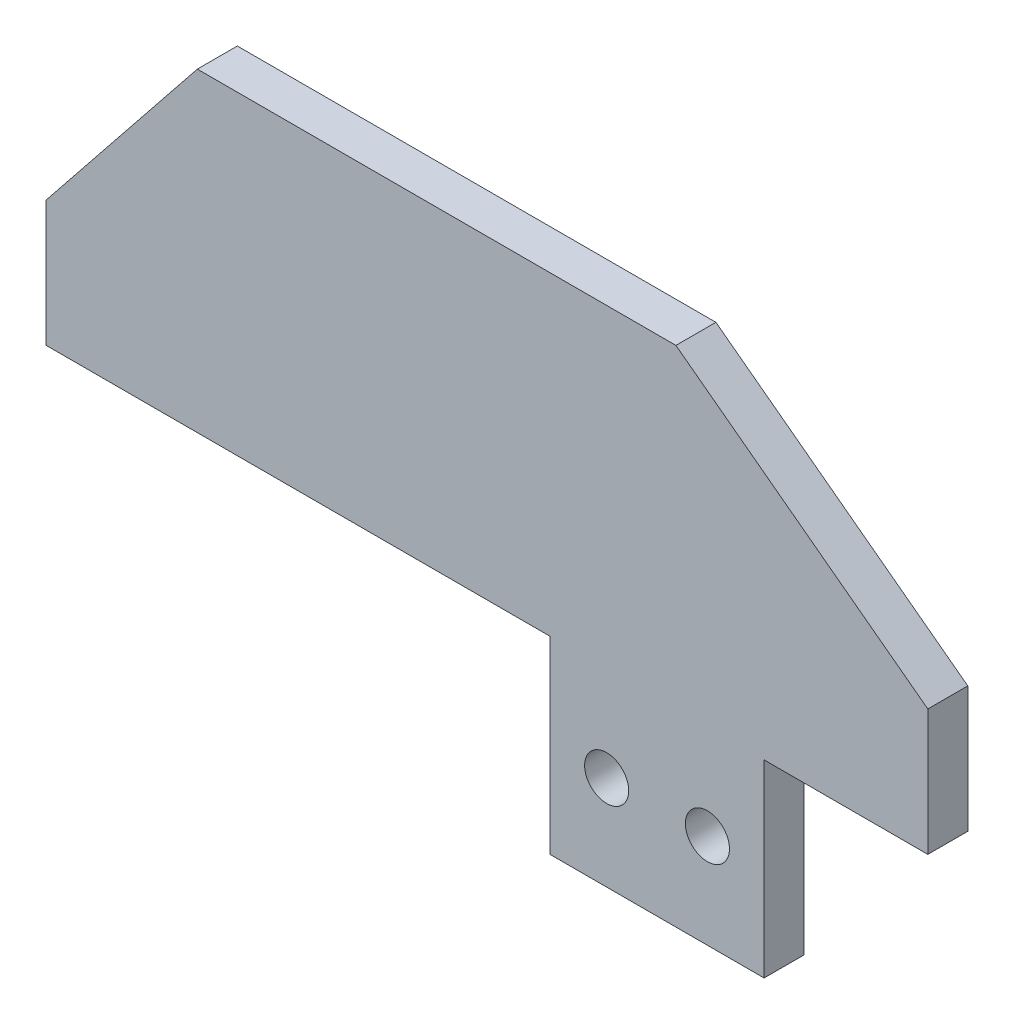
ISO-10303-21;
HEADER;
FILE_DESCRIPTION(('STEP AP214'),'2;1');
FILE_NAME('part.step','',(''),(''),'','','');
FILE_SCHEMA(('AUTOMOTIVE_DESIGN { 1 0 10303 214 1 1 1 1 }'));
ENDSEC;
DATA;
#1=APPLICATION_CONTEXT('core data for automotive mechanical design processes');
#2=APPLICATION_PROTOCOL_DEFINITION('international standard','automotive_design',2000,#1);
#3=PRODUCT_CONTEXT('',#1,'mechanical');
#4=PRODUCT('Part','Part','',(#3));
#5=PRODUCT_RELATED_PRODUCT_CATEGORY('part','',(#4));
#6=PRODUCT_DEFINITION_FORMATION('','',#4);
#7=PRODUCT_DEFINITION_CONTEXT('part definition',#1,'design');
#8=PRODUCT_DEFINITION('design','',#6,#7);
#9=PRODUCT_DEFINITION_SHAPE('','',#8);
#10=(LENGTH_UNIT() NAMED_UNIT(*) SI_UNIT(.MILLI.,.METRE.));
#11=(NAMED_UNIT(*) PLANE_ANGLE_UNIT() SI_UNIT($,.RADIAN.));
#12=(NAMED_UNIT(*) SI_UNIT($,.STERADIAN.) SOLID_ANGLE_UNIT());
#13=UNCERTAINTY_MEASURE_WITH_UNIT(LENGTH_MEASURE(1.E-05),#10,'distance_accuracy_value','');
#14=(GEOMETRIC_REPRESENTATION_CONTEXT(3) GLOBAL_UNCERTAINTY_ASSIGNED_CONTEXT((#13)) GLOBAL_UNIT_ASSIGNED_CONTEXT((#10,
#11,#12)) REPRESENTATION_CONTEXT('',''));
#15=CARTESIAN_POINT('',(0.,0.,0.));
#16=DIRECTION('',(0.,0.,1.));
#17=DIRECTION('',(1.,0.,0.));
#18=AXIS2_PLACEMENT_3D('',#15,#16,#17);
#19=CARTESIAN_POINT('',(8.50000000000001,0.,-3.175));
#20=DIRECTION('',(1.,0.,0.));
#21=DIRECTION('',(0.,1.,0.));
#22=AXIS2_PLACEMENT_3D('',#19,#20,#21);
#23=PLANE('',#22);
#24=DIRECTION('',(0.,-1.,0.));
#25=VECTOR('',#24,1.);
#26=CARTESIAN_POINT('',(8.50000000000001,0.,0.));
#27=LINE('',#26,#25);
#28=CARTESIAN_POINT('',(8.5,57.,0.));
#29=VERTEX_POINT('',#28);
#30=CARTESIAN_POINT('',(8.5,42.,0.));
#31=VERTEX_POINT('',#30);
#32=EDGE_CURVE('E196',#29,#31,#27,.T.);
#33=ORIENTED_EDGE('',*,*,#32,.T.);
#34=DIRECTION('',(0.,0.,1.));
#35=VECTOR('',#34,1.);
#36=CARTESIAN_POINT('',(8.5,42.,-3.175));
#37=LINE('',#36,#35);
#38=CARTESIAN_POINT('',(8.5,42.,-3.175));
#39=VERTEX_POINT('',#38);
#40=EDGE_CURVE('E171',#39,#31,#37,.T.);
#41=ORIENTED_EDGE('',*,*,#40,.F.);
#42=DIRECTION('',(0.,-1.,0.));
#43=VECTOR('',#42,1.);
#44=CARTESIAN_POINT('',(8.50000000000001,0.,-3.175));
#45=LINE('',#44,#43);
#46=CARTESIAN_POINT('',(8.5,57.,-3.175));
#47=VERTEX_POINT('',#46);
#48=EDGE_CURVE('E151',#47,#39,#45,.T.);
#49=ORIENTED_EDGE('',*,*,#48,.F.);
#50=DIRECTION('',(0.,0.,1.));
#51=VECTOR('',#50,1.);
#52=CARTESIAN_POINT('',(8.5,57.,-3.175));
#53=LINE('',#52,#51);
#54=EDGE_CURVE('E11',#47,#29,#53,.T.);
#55=ORIENTED_EDGE('',*,*,#54,.T.);
#56=EDGE_LOOP('',(#33,#41,#49,#55));
#57=FACE_BOUND('',#56,.T.);
#58=ADVANCED_FACE('F43',(#57),#23,.T.);
#59=CARTESIAN_POINT('',(0.,57.,-3.175));
#60=DIRECTION('',(0.,1.,0.));
#61=DIRECTION('',(0.,0.,-1.));
#62=AXIS2_PLACEMENT_3D('',#59,#60,#61);
#63=PLANE('',#62);
#64=DIRECTION('',(1.,0.,0.));
#65=VECTOR('',#64,1.);
#66=CARTESIAN_POINT('',(0.,57.,0.));
#67=LINE('',#66,#65);
#68=CARTESIAN_POINT('',(21.5,57.,0.));
#69=VERTEX_POINT('',#68);
#70=EDGE_CURVE('E189',#29,#69,#67,.T.);
#71=ORIENTED_EDGE('',*,*,#70,.F.);
#72=ORIENTED_EDGE('',*,*,#54,.F.);
#73=DIRECTION('',(1.,0.,0.));
#74=VECTOR('',#73,1.);
#75=CARTESIAN_POINT('',(0.,57.,-3.175));
#76=LINE('',#75,#74);
#77=CARTESIAN_POINT('',(21.5,57.,-3.175));
#78=VERTEX_POINT('',#77);
#79=EDGE_CURVE('E104',#47,#78,#76,.T.);
#80=ORIENTED_EDGE('',*,*,#79,.T.);
#81=DIRECTION('',(0.,0.,1.));
#82=VECTOR('',#81,1.);
#83=CARTESIAN_POINT('',(21.5,57.,-3.175));
#84=LINE('',#83,#82);
#85=EDGE_CURVE('E52',#78,#69,#84,.T.);
#86=ORIENTED_EDGE('',*,*,#85,.T.);
#87=EDGE_LOOP('',(#71,#72,#80,#86));
#88=FACE_BOUND('',#87,.T.);
#89=ADVANCED_FACE('F188',(#88),#63,.F.);
#90=CARTESIAN_POINT('',(21.5,0.,-3.175));
#91=DIRECTION('',(-1.,0.,0.));
#92=DIRECTION('',(0.,0.,-1.));
#93=AXIS2_PLACEMENT_3D('',#90,#91,#92);
#94=PLANE('',#93);
#95=DIRECTION('',(0.,1.,0.));
#96=VECTOR('',#95,1.);
#97=CARTESIAN_POINT('',(21.5,0.,0.));
#98=LINE('',#97,#96);
#99=CARTESIAN_POINT('',(21.5,67.,0.));
#100=VERTEX_POINT('',#99);
#101=EDGE_CURVE('E194',#69,#100,#98,.T.);
#102=ORIENTED_EDGE('',*,*,#101,.F.);
#103=ORIENTED_EDGE('',*,*,#85,.F.);
#104=DIRECTION('',(0.,1.,0.));
#105=VECTOR('',#104,1.);
#106=CARTESIAN_POINT('',(21.5,0.,-3.175));
#107=LINE('',#106,#105);
#108=CARTESIAN_POINT('',(21.5,67.,-3.175));
#109=VERTEX_POINT('',#108);
#110=EDGE_CURVE('E150',#78,#109,#107,.T.);
#111=ORIENTED_EDGE('',*,*,#110,.T.);
#112=DIRECTION('',(0.,0.,1.));
#113=VECTOR('',#112,1.);
#114=CARTESIAN_POINT('',(21.5,67.,-3.175));
#115=LINE('',#114,#113);
#116=EDGE_CURVE('E184',#109,#100,#115,.T.);
#117=ORIENTED_EDGE('',*,*,#116,.T.);
#118=EDGE_LOOP('',(#102,#103,#111,#117));
#119=FACE_BOUND('',#118,.T.);
#120=ADVANCED_FACE('F216',(#119),#94,.F.);
#121=CARTESIAN_POINT('',(39.9,53.2,-3.175));
#122=DIRECTION('',(-0.6,-0.8,0.));
#123=DIRECTION('',(0.8,-0.6,0.));
#124=AXIS2_PLACEMENT_3D('',#121,#122,#123);
#125=PLANE('',#124);
#126=DIRECTION('',(-0.8,0.6,0.));
#127=VECTOR('',#126,1.);
#128=CARTESIAN_POINT('',(39.9,53.2,0.));
#129=LINE('',#128,#127);
#130=CARTESIAN_POINT('',(1.5,82.,0.));
#131=VERTEX_POINT('',#130);
#132=EDGE_CURVE('E198',#100,#131,#129,.T.);
#133=ORIENTED_EDGE('',*,*,#132,.F.);
#134=ORIENTED_EDGE('',*,*,#116,.F.);
#135=DIRECTION('',(-0.8,0.6,0.));
#136=VECTOR('',#135,1.);
#137=CARTESIAN_POINT('',(39.9,53.2,-3.175));
#138=LINE('',#137,#136);
#139=CARTESIAN_POINT('',(1.5,82.,-3.175));
#140=VERTEX_POINT('',#139);
#141=EDGE_CURVE('E155',#109,#140,#138,.T.);
#142=ORIENTED_EDGE('',*,*,#141,.T.);
#143=DIRECTION('',(0.,0.,1.));
#144=VECTOR('',#143,1.);
#145=CARTESIAN_POINT('',(1.5,82.,-3.175));
#146=LINE('',#145,#144);
#147=EDGE_CURVE('E181',#140,#131,#146,.T.);
#148=ORIENTED_EDGE('',*,*,#147,.T.);
#149=EDGE_LOOP('',(#133,#134,#142,#148));
#150=FACE_BOUND('',#149,.T.);
#151=ADVANCED_FACE('F213',(#150),#125,.F.);
#152=CARTESIAN_POINT('',(0.,82.,-3.175));
#153=DIRECTION('',(0.,-1.,0.));
#154=DIRECTION('',(1.,0.,0.));
#155=AXIS2_PLACEMENT_3D('',#152,#153,#154);
#156=PLANE('',#155);
#157=DIRECTION('',(-1.,0.,0.));
#158=VECTOR('',#157,1.);
#159=CARTESIAN_POINT('',(0.,82.,0.));
#160=LINE('',#159,#158);
#161=CARTESIAN_POINT('',(-36.5,82.,0.));
#162=VERTEX_POINT('',#161);
#163=EDGE_CURVE('E206',#131,#162,#160,.T.);
#164=ORIENTED_EDGE('',*,*,#163,.F.);
#165=ORIENTED_EDGE('',*,*,#147,.F.);
#166=DIRECTION('',(-1.,0.,0.));
#167=VECTOR('',#166,1.);
#168=CARTESIAN_POINT('',(0.,82.,-3.175));
#169=LINE('',#168,#167);
#170=CARTESIAN_POINT('',(-36.5,82.,-3.175));
#171=VERTEX_POINT('',#170);
#172=EDGE_CURVE('E218',#140,#171,#169,.T.);
#173=ORIENTED_EDGE('',*,*,#172,.T.);
#174=DIRECTION('',(0.,0.,1.));
#175=VECTOR('',#174,1.);
#176=CARTESIAN_POINT('',(-36.5,82.,-3.175));
#177=LINE('',#176,#175);
#178=EDGE_CURVE('E178',#171,#162,#177,.T.);
#179=ORIENTED_EDGE('',*,*,#178,.T.);
#180=EDGE_LOOP('',(#164,#165,#173,#179));
#181=FACE_BOUND('',#180,.T.);
#182=ADVANCED_FACE('F273',(#181),#156,.F.);
#183=CARTESIAN_POINT('',(-62.2560975609756,49.8048780487805,-3.175));
#184=DIRECTION('',(0.78086880944303,-0.624695047554425,0.));
#185=DIRECTION('',(0.624695047554425,0.78086880944303,0.));
#186=AXIS2_PLACEMENT_3D('',#183,#184,#185);
#187=PLANE('',#186);
#188=DIRECTION('',(-0.624695047554425,-0.78086880944303,0.));
#189=VECTOR('',#188,1.);
#190=CARTESIAN_POINT('',(-62.2560975609756,49.8048780487805,0.));
#191=LINE('',#190,#189);
#192=CARTESIAN_POINT('',(-48.5,67.,0.));
#193=VERTEX_POINT('',#192);
#194=EDGE_CURVE('E204',#162,#193,#191,.T.);
#195=ORIENTED_EDGE('',*,*,#194,.F.);
#196=ORIENTED_EDGE('',*,*,#178,.F.);
#197=DIRECTION('',(-0.624695047554425,-0.78086880944303,0.));
#198=VECTOR('',#197,1.);
#199=CARTESIAN_POINT('',(-62.2560975609756,49.8048780487805,-3.175));
#200=LINE('',#199,#198);
#201=CARTESIAN_POINT('',(-48.5,67.,-3.175));
#202=VERTEX_POINT('',#201);
#203=EDGE_CURVE('E146',#171,#202,#200,.T.);
#204=ORIENTED_EDGE('',*,*,#203,.T.);
#205=DIRECTION('',(0.,0.,1.));
#206=VECTOR('',#205,1.);
#207=CARTESIAN_POINT('',(-48.5,67.,-3.175));
#208=LINE('',#207,#206);
#209=EDGE_CURVE('E175',#202,#193,#208,.T.);
#210=ORIENTED_EDGE('',*,*,#209,.T.);
#211=EDGE_LOOP('',(#195,#196,#204,#210));
#212=FACE_BOUND('',#211,.T.);
#213=ADVANCED_FACE('F269',(#212),#187,.F.);
#214=CARTESIAN_POINT('',(-48.5,0.,-3.175));
#215=DIRECTION('',(1.,0.,0.));
#216=DIRECTION('',(0.,0.,1.));
#217=AXIS2_PLACEMENT_3D('',#214,#215,#216);
#218=PLANE('',#217);
#219=DIRECTION('',(0.,-1.,0.));
#220=VECTOR('',#219,1.);
#221=CARTESIAN_POINT('',(-48.5,0.,0.));
#222=LINE('',#221,#220);
#223=CARTESIAN_POINT('',(-48.5,57.,0.));
#224=VERTEX_POINT('',#223);
#225=EDGE_CURVE('E202',#193,#224,#222,.T.);
#226=ORIENTED_EDGE('',*,*,#225,.F.);
#227=ORIENTED_EDGE('',*,*,#209,.F.);
#228=DIRECTION('',(0.,-1.,0.));
#229=VECTOR('',#228,1.);
#230=CARTESIAN_POINT('',(-48.5,0.,-3.175));
#231=LINE('',#230,#229);
#232=CARTESIAN_POINT('',(-48.5,57.,-3.175));
#233=VERTEX_POINT('',#232);
#234=EDGE_CURVE('E144',#202,#233,#231,.T.);
#235=ORIENTED_EDGE('',*,*,#234,.T.);
#236=DIRECTION('',(0.,0.,1.));
#237=VECTOR('',#236,1.);
#238=CARTESIAN_POINT('',(-48.5,57.,-3.175));
#239=LINE('',#238,#237);
#240=EDGE_CURVE('E138',#233,#224,#239,.T.);
#241=ORIENTED_EDGE('',*,*,#240,.T.);
#242=EDGE_LOOP('',(#226,#227,#235,#241));
#243=FACE_BOUND('',#242,.T.);
#244=ADVANCED_FACE('F265',(#243),#218,.F.);
#245=CARTESIAN_POINT('',(-8.5,57.,0.));
#246=VERTEX_POINT('',#245);
#247=EDGE_CURVE('E167',#224,#246,#67,.T.);
#248=ORIENTED_EDGE('',*,*,#247,.F.);
#249=ORIENTED_EDGE('',*,*,#240,.F.);
#250=CARTESIAN_POINT('',(-8.5,57.,-3.175));
#251=VERTEX_POINT('',#250);
#252=EDGE_CURVE('E128',#233,#251,#76,.T.);
#253=ORIENTED_EDGE('',*,*,#252,.T.);
#254=DIRECTION('',(0.,0.,1.));
#255=VECTOR('',#254,1.);
#256=CARTESIAN_POINT('',(-8.5,57.,-3.175));
#257=LINE('',#256,#255);
#258=EDGE_CURVE('E133',#251,#246,#257,.T.);
#259=ORIENTED_EDGE('',*,*,#258,.T.);
#260=EDGE_LOOP('',(#248,#249,#253,#259));
#261=FACE_BOUND('',#260,.T.);
#262=ADVANCED_FACE('F141',(#261),#63,.F.);
#263=CARTESIAN_POINT('',(-8.49999999999999,0.,-3.175));
#264=DIRECTION('',(1.,0.,0.));
#265=DIRECTION('',(0.,1.,0.));
#266=AXIS2_PLACEMENT_3D('',#263,#264,#265);
#267=PLANE('',#266);
#268=DIRECTION('',(0.,-1.,0.));
#269=VECTOR('',#268,1.);
#270=CARTESIAN_POINT('',(-8.49999999999999,0.,0.));
#271=LINE('',#270,#269);
#272=CARTESIAN_POINT('',(-8.5,42.,0.));
#273=VERTEX_POINT('',#272);
#274=EDGE_CURVE('E135',#246,#273,#271,.T.);
#275=ORIENTED_EDGE('',*,*,#274,.F.);
#276=ORIENTED_EDGE('',*,*,#258,.F.);
#277=DIRECTION('',(0.,-1.,0.));
#278=VECTOR('',#277,1.);
#279=CARTESIAN_POINT('',(-8.49999999999999,0.,-3.175));
#280=LINE('',#279,#278);
#281=CARTESIAN_POINT('',(-8.5,42.,-3.175));
#282=VERTEX_POINT('',#281);
#283=EDGE_CURVE('E124',#251,#282,#280,.T.);
#284=ORIENTED_EDGE('',*,*,#283,.T.);
#285=DIRECTION('',(0.,0.,1.));
#286=VECTOR('',#285,1.);
#287=CARTESIAN_POINT('',(-8.5,42.,-3.175));
#288=LINE('',#287,#286);
#289=EDGE_CURVE('E139',#282,#273,#288,.T.);
#290=ORIENTED_EDGE('',*,*,#289,.T.);
#291=EDGE_LOOP('',(#275,#276,#284,#290));
#292=FACE_BOUND('',#291,.T.);
#293=ADVANCED_FACE('F134',(#292),#267,.F.);
#294=CARTESIAN_POINT('',(4.,49.5,-3.175));
#295=DIRECTION('',(0.,0.,1.));
#296=DIRECTION('',(-1.,0.,0.));
#297=AXIS2_PLACEMENT_3D('',#294,#295,#296);
#298=CYLINDRICAL_SURFACE('',#297,1.75);
#299=CARTESIAN_POINT('',(4.,49.5,-3.175));
#300=DIRECTION('',(0.,0.,1.));
#301=DIRECTION('',(1.,0.,0.));
#302=AXIS2_PLACEMENT_3D('',#299,#300,#301);
#303=CIRCLE('',#302,1.75);
#304=CARTESIAN_POINT('',(5.75,49.5,-3.175));
#305=VERTEX_POINT('',#304);
#306=EDGE_CURVE('E156',#305,#305,#303,.T.);
#307=ORIENTED_EDGE('',*,*,#306,.F.);
#308=EDGE_LOOP('',(#307));
#309=FACE_BOUND('',#308,.T.);
#310=CARTESIAN_POINT('',(4.,49.5,0.));
#311=DIRECTION('',(0.,0.,1.));
#312=DIRECTION('',(1.,0.,0.));
#313=AXIS2_PLACEMENT_3D('',#310,#311,#312);
#314=CIRCLE('',#313,1.75);
#315=CARTESIAN_POINT('',(5.75,49.5,0.));
#316=VERTEX_POINT('',#315);
#317=EDGE_CURVE('E200',#316,#316,#314,.T.);
#318=ORIENTED_EDGE('',*,*,#317,.T.);
#319=EDGE_LOOP('',(#318));
#320=FACE_BOUND('',#319,.T.);
#321=ADVANCED_FACE('F231',(#309,#320),#298,.F.);
#322=CARTESIAN_POINT('',(-4.,49.5,-3.175));
#323=DIRECTION('',(0.,0.,1.));
#324=DIRECTION('',(-1.,0.,0.));
#325=AXIS2_PLACEMENT_3D('',#322,#323,#324);
#326=CYLINDRICAL_SURFACE('',#325,1.75);
#327=CARTESIAN_POINT('',(-4.,49.5,-3.175));
#328=DIRECTION('',(0.,0.,1.));
#329=DIRECTION('',(1.,0.,0.));
#330=AXIS2_PLACEMENT_3D('',#327,#328,#329);
#331=CIRCLE('',#330,1.75);
#332=CARTESIAN_POINT('',(-2.25,49.5,-3.175));
#333=VERTEX_POINT('',#332);
#334=EDGE_CURVE('E160',#333,#333,#331,.T.);
#335=ORIENTED_EDGE('',*,*,#334,.F.);
#336=EDGE_LOOP('',(#335));
#337=FACE_BOUND('',#336,.T.);
#338=CARTESIAN_POINT('',(-4.,49.5,0.));
#339=DIRECTION('',(0.,0.,1.));
#340=DIRECTION('',(1.,0.,0.));
#341=AXIS2_PLACEMENT_3D('',#338,#339,#340);
#342=CIRCLE('',#341,1.75);
#343=CARTESIAN_POINT('',(-2.25,49.5,0.));
#344=VERTEX_POINT('',#343);
#345=EDGE_CURVE('E225',#344,#344,#342,.T.);
#346=ORIENTED_EDGE('',*,*,#345,.T.);
#347=EDGE_LOOP('',(#346));
#348=FACE_BOUND('',#347,.T.);
#349=ADVANCED_FACE('F45',(#337,#348),#326,.F.);
#350=CARTESIAN_POINT('',(0.,42.,-3.175));
#351=DIRECTION('',(0.,1.,0.));
#352=DIRECTION('',(0.,0.,-1.));
#353=AXIS2_PLACEMENT_3D('',#350,#351,#352);
#354=PLANE('',#353);
#355=DIRECTION('',(1.,0.,0.));
#356=VECTOR('',#355,1.);
#357=CARTESIAN_POINT('',(0.,42.,0.));
#358=LINE('',#357,#356);
#359=EDGE_CURVE('E92',#273,#31,#358,.T.);
#360=ORIENTED_EDGE('',*,*,#359,.F.);
#361=ORIENTED_EDGE('',*,*,#289,.F.);
#362=DIRECTION('',(1.,0.,0.));
#363=VECTOR('',#362,1.);
#364=CARTESIAN_POINT('',(0.,42.,-3.175));
#365=LINE('',#364,#363);
#366=EDGE_CURVE('E60',#282,#39,#365,.T.);
#367=ORIENTED_EDGE('',*,*,#366,.T.);
#368=ORIENTED_EDGE('',*,*,#40,.T.);
#369=EDGE_LOOP('',(#360,#361,#367,#368));
#370=FACE_BOUND('',#369,.T.);
#371=ADVANCED_FACE('F239',(#370),#354,.F.);
#372=CARTESIAN_POINT('',(0.,0.,-3.175));
#373=DIRECTION('',(0.,0.,-1.));
#374=DIRECTION('',(1.,0.,0.));
#375=AXIS2_PLACEMENT_3D('',#372,#373,#374);
#376=PLANE('',#375);
#377=ORIENTED_EDGE('',*,*,#334,.T.);
#378=EDGE_LOOP('',(#377));
#379=FACE_BOUND('',#378,.T.);
#380=ORIENTED_EDGE('',*,*,#306,.T.);
#381=EDGE_LOOP('',(#380));
#382=FACE_BOUND('',#381,.T.);
#383=ORIENTED_EDGE('',*,*,#48,.T.);
#384=ORIENTED_EDGE('',*,*,#366,.F.);
#385=ORIENTED_EDGE('',*,*,#283,.F.);
#386=ORIENTED_EDGE('',*,*,#252,.F.);
#387=ORIENTED_EDGE('',*,*,#234,.F.);
#388=ORIENTED_EDGE('',*,*,#203,.F.);
#389=ORIENTED_EDGE('',*,*,#172,.F.);
#390=ORIENTED_EDGE('',*,*,#141,.F.);
#391=ORIENTED_EDGE('',*,*,#110,.F.);
#392=ORIENTED_EDGE('',*,*,#79,.F.);
#393=EDGE_LOOP('',(#383,#384,#385,#386,#387,#388,#389,#390,#391,#392));
#394=FACE_BOUND('',#393,.T.);
#395=ADVANCED_FACE('F126',(#379,#382,#394),#376,.T.);
#396=CARTESIAN_POINT('',(0.,0.,0.));
#397=DIRECTION('',(0.,0.,-1.));
#398=DIRECTION('',(1.,0.,0.));
#399=AXIS2_PLACEMENT_3D('',#396,#397,#398);
#400=PLANE('',#399);
#401=ORIENTED_EDGE('',*,*,#345,.F.);
#402=EDGE_LOOP('',(#401));
#403=FACE_BOUND('',#402,.T.);
#404=ORIENTED_EDGE('',*,*,#317,.F.);
#405=EDGE_LOOP('',(#404));
#406=FACE_BOUND('',#405,.T.);
#407=ORIENTED_EDGE('',*,*,#32,.F.);
#408=ORIENTED_EDGE('',*,*,#70,.T.);
#409=ORIENTED_EDGE('',*,*,#101,.T.);
#410=ORIENTED_EDGE('',*,*,#132,.T.);
#411=ORIENTED_EDGE('',*,*,#163,.T.);
#412=ORIENTED_EDGE('',*,*,#194,.T.);
#413=ORIENTED_EDGE('',*,*,#225,.T.);
#414=ORIENTED_EDGE('',*,*,#247,.T.);
#415=ORIENTED_EDGE('',*,*,#274,.T.);
#416=ORIENTED_EDGE('',*,*,#359,.T.);
#417=EDGE_LOOP('',(#407,#408,#409,#410,#411,#412,#413,#414,#415,#416));
#418=FACE_BOUND('',#417,.T.);
#419=ADVANCED_FACE('F192',(#403,#406,#418),#400,.F.);
#420=CLOSED_SHELL('',(#58,#89,#120,#151,#182,#213,#244,#262,#293,#321,#349,#371,#395,#419));
#421=MANIFOLD_SOLID_BREP('B2',#420);
#422=ADVANCED_BREP_SHAPE_REPRESENTATION('',(#18,#421),#14);
#423=SHAPE_DEFINITION_REPRESENTATION(#9,#422);
ENDSEC;
END-ISO-10303-21;
